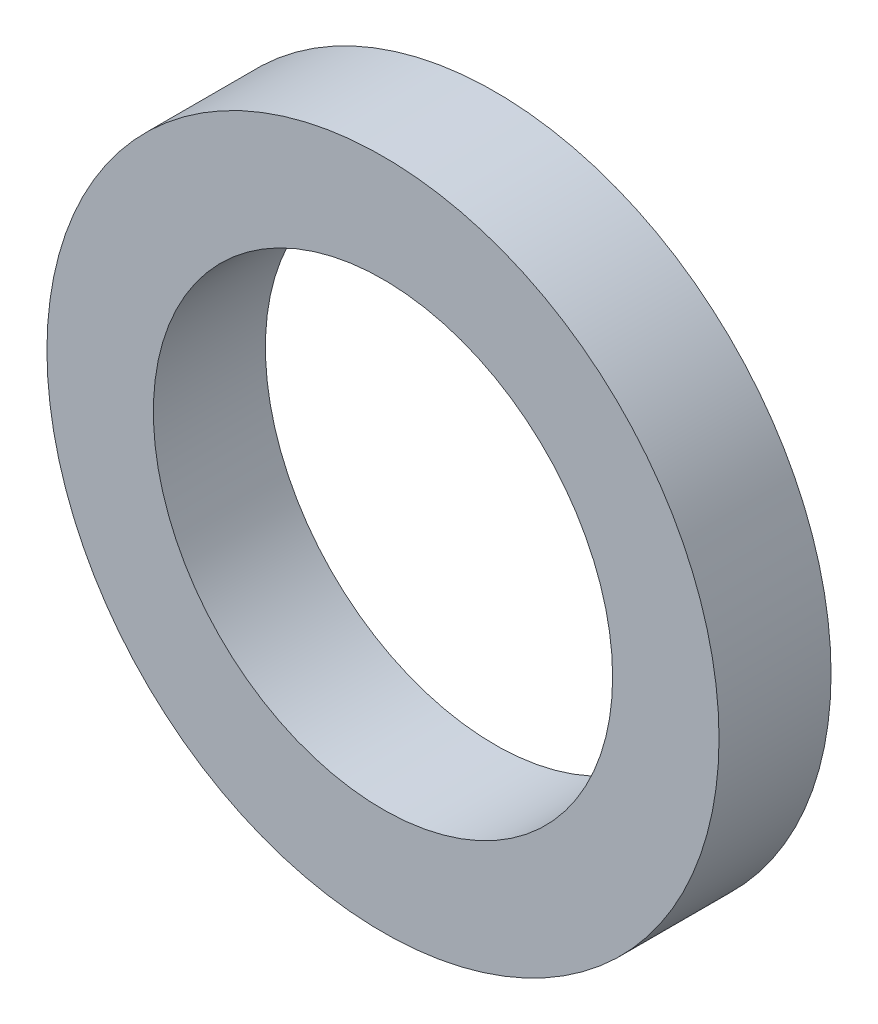
ISO-10303-21;
HEADER;
FILE_DESCRIPTION(('STEP AP214'),'2;1');
FILE_NAME('part.step','',(''),(''),'','','');
FILE_SCHEMA(('AUTOMOTIVE_DESIGN { 1 0 10303 214 1 1 1 1 }'));
ENDSEC;
DATA;
#1=APPLICATION_CONTEXT('core data for automotive mechanical design processes');
#2=APPLICATION_PROTOCOL_DEFINITION('international standard','automotive_design',2000,#1);
#3=PRODUCT_CONTEXT('',#1,'mechanical');
#4=PRODUCT('Part','Part','',(#3));
#5=PRODUCT_RELATED_PRODUCT_CATEGORY('part','',(#4));
#6=PRODUCT_DEFINITION_FORMATION('','',#4);
#7=PRODUCT_DEFINITION_CONTEXT('part definition',#1,'design');
#8=PRODUCT_DEFINITION('design','',#6,#7);
#9=PRODUCT_DEFINITION_SHAPE('','',#8);
#10=(LENGTH_UNIT() NAMED_UNIT(*) SI_UNIT(.MILLI.,.METRE.));
#11=(NAMED_UNIT(*) PLANE_ANGLE_UNIT() SI_UNIT($,.RADIAN.));
#12=(NAMED_UNIT(*) SI_UNIT($,.STERADIAN.) SOLID_ANGLE_UNIT());
#13=UNCERTAINTY_MEASURE_WITH_UNIT(LENGTH_MEASURE(1.E-05),#10,'distance_accuracy_value','');
#14=(GEOMETRIC_REPRESENTATION_CONTEXT(3) GLOBAL_UNCERTAINTY_ASSIGNED_CONTEXT((#13)) GLOBAL_UNIT_ASSIGNED_CONTEXT((#10,
#11,#12)) REPRESENTATION_CONTEXT('',''));
#15=CARTESIAN_POINT('',(0.,0.,0.));
#16=DIRECTION('',(0.,0.,1.));
#17=DIRECTION('',(1.,0.,0.));
#18=AXIS2_PLACEMENT_3D('',#15,#16,#17);
#19=CARTESIAN_POINT('',(0.,0.,2.));
#20=DIRECTION('',(0.,0.,1.));
#21=DIRECTION('',(1.,0.,0.));
#22=AXIS2_PLACEMENT_3D('',#19,#20,#21);
#23=PLANE('',#22);
#24=CARTESIAN_POINT('',(0.,0.,2.));
#25=DIRECTION('',(0.,0.,1.));
#26=DIRECTION('',(1.,0.,0.));
#27=AXIS2_PLACEMENT_3D('',#24,#25,#26);
#28=CIRCLE('',#27,6.);
#29=CARTESIAN_POINT('',(6.,0.,2.));
#30=VERTEX_POINT('',#29);
#31=EDGE_CURVE('E10',#30,#30,#28,.T.);
#32=ORIENTED_EDGE('',*,*,#31,.T.);
#33=EDGE_LOOP('',(#32));
#34=FACE_BOUND('',#33,.T.);
#35=CARTESIAN_POINT('',(0.,0.,2.));
#36=DIRECTION('',(0.,0.,1.));
#37=DIRECTION('',(1.,0.,0.));
#38=AXIS2_PLACEMENT_3D('',#35,#36,#37);
#39=CIRCLE('',#38,4.1);
#40=CARTESIAN_POINT('',(4.1,0.,2.));
#41=VERTEX_POINT('',#40);
#42=EDGE_CURVE('E48',#41,#41,#39,.T.);
#43=ORIENTED_EDGE('',*,*,#42,.F.);
#44=EDGE_LOOP('',(#43));
#45=FACE_BOUND('',#44,.T.);
#46=ADVANCED_FACE('F40',(#34,#45),#23,.T.);
#47=CARTESIAN_POINT('',(0.,0.,0.));
#48=DIRECTION('',(0.,0.,1.));
#49=DIRECTION('',(1.,0.,0.));
#50=AXIS2_PLACEMENT_3D('',#47,#48,#49);
#51=PLANE('',#50);
#52=CARTESIAN_POINT('',(0.,0.,0.));
#53=DIRECTION('',(0.,0.,1.));
#54=DIRECTION('',(1.,0.,0.));
#55=AXIS2_PLACEMENT_3D('',#52,#53,#54);
#56=CIRCLE('',#55,6.);
#57=CARTESIAN_POINT('',(6.,0.,0.));
#58=VERTEX_POINT('',#57);
#59=EDGE_CURVE('E41',#58,#58,#56,.T.);
#60=ORIENTED_EDGE('',*,*,#59,.F.);
#61=EDGE_LOOP('',(#60));
#62=FACE_BOUND('',#61,.T.);
#63=CARTESIAN_POINT('',(0.,0.,0.));
#64=DIRECTION('',(0.,0.,1.));
#65=DIRECTION('',(1.,0.,0.));
#66=AXIS2_PLACEMENT_3D('',#63,#64,#65);
#67=CIRCLE('',#66,4.1);
#68=CARTESIAN_POINT('',(4.1,0.,0.));
#69=VERTEX_POINT('',#68);
#70=EDGE_CURVE('E49',#69,#69,#67,.T.);
#71=ORIENTED_EDGE('',*,*,#70,.T.);
#72=EDGE_LOOP('',(#71));
#73=FACE_BOUND('',#72,.T.);
#74=ADVANCED_FACE('F58',(#62,#73),#51,.F.);
#75=CARTESIAN_POINT('',(0.,0.,2.));
#76=DIRECTION('',(0.,0.,-1.));
#77=DIRECTION('',(-1.,0.,0.));
#78=AXIS2_PLACEMENT_3D('',#75,#76,#77);
#79=CYLINDRICAL_SURFACE('',#78,6.);
#80=ORIENTED_EDGE('',*,*,#31,.F.);
#81=EDGE_LOOP('',(#80));
#82=FACE_BOUND('',#81,.T.);
#83=ORIENTED_EDGE('',*,*,#59,.T.);
#84=EDGE_LOOP('',(#83));
#85=FACE_BOUND('',#84,.T.);
#86=ADVANCED_FACE('F39',(#82,#85),#79,.T.);
#87=CARTESIAN_POINT('',(0.,0.,2.));
#88=DIRECTION('',(0.,0.,-1.));
#89=DIRECTION('',(-1.,0.,0.));
#90=AXIS2_PLACEMENT_3D('',#87,#88,#89);
#91=CYLINDRICAL_SURFACE('',#90,4.1);
#92=ORIENTED_EDGE('',*,*,#42,.T.);
#93=EDGE_LOOP('',(#92));
#94=FACE_BOUND('',#93,.T.);
#95=ORIENTED_EDGE('',*,*,#70,.F.);
#96=EDGE_LOOP('',(#95));
#97=FACE_BOUND('',#96,.T.);
#98=ADVANCED_FACE('F57',(#94,#97),#91,.F.);
#99=CLOSED_SHELL('',(#46,#74,#86,#98));
#100=MANIFOLD_SOLID_BREP('B2',#99);
#101=ADVANCED_BREP_SHAPE_REPRESENTATION('',(#18,#100),#14);
#102=SHAPE_DEFINITION_REPRESENTATION(#9,#101);
ENDSEC;
END-ISO-10303-21;
